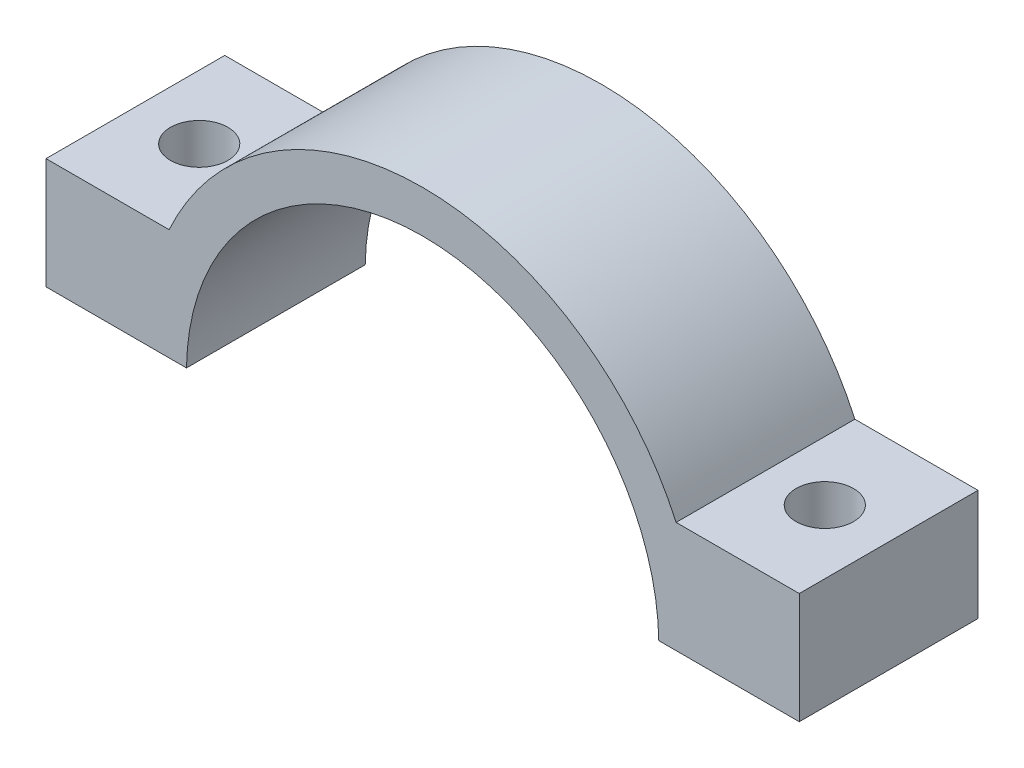
ISO-10303-21;
HEADER;
FILE_DESCRIPTION(('STEP AP214'),'2;1');
FILE_NAME('part.step','',(''),(''),'','','');
FILE_SCHEMA(('AUTOMOTIVE_DESIGN { 1 0 10303 214 1 1 1 1 }'));
ENDSEC;
DATA;
#1=APPLICATION_CONTEXT('core data for automotive mechanical design processes');
#2=APPLICATION_PROTOCOL_DEFINITION('international standard','automotive_design',2000,#1);
#3=PRODUCT_CONTEXT('',#1,'mechanical');
#4=PRODUCT('Part','Part','',(#3));
#5=PRODUCT_RELATED_PRODUCT_CATEGORY('part','',(#4));
#6=PRODUCT_DEFINITION_FORMATION('','',#4);
#7=PRODUCT_DEFINITION_CONTEXT('part definition',#1,'design');
#8=PRODUCT_DEFINITION('design','',#6,#7);
#9=PRODUCT_DEFINITION_SHAPE('','',#8);
#10=(LENGTH_UNIT() NAMED_UNIT(*) SI_UNIT(.MILLI.,.METRE.));
#11=(NAMED_UNIT(*) PLANE_ANGLE_UNIT() SI_UNIT($,.RADIAN.));
#12=(NAMED_UNIT(*) SI_UNIT($,.STERADIAN.) SOLID_ANGLE_UNIT());
#13=UNCERTAINTY_MEASURE_WITH_UNIT(LENGTH_MEASURE(1.E-05),#10,'distance_accuracy_value','');
#14=(GEOMETRIC_REPRESENTATION_CONTEXT(3) GLOBAL_UNCERTAINTY_ASSIGNED_CONTEXT((#13)) GLOBAL_UNIT_ASSIGNED_CONTEXT((#10,
#11,#12)) REPRESENTATION_CONTEXT('',''));
#15=CARTESIAN_POINT('',(0.,0.,0.));
#16=DIRECTION('',(0.,0.,1.));
#17=DIRECTION('',(1.,0.,0.));
#18=AXIS2_PLACEMENT_3D('',#15,#16,#17);
#19=CARTESIAN_POINT('',(0.,28.4999999993568,14.));
#20=DIRECTION('',(0.,0.,-1.));
#21=DIRECTION('',(-1.,0.,0.));
#22=AXIS2_PLACEMENT_3D('',#19,#20,#21);
#23=CYLINDRICAL_SURFACE('',#22,21.8000000006432);
#24=CARTESIAN_POINT('',(0.,28.4999999993568,0.));
#25=DIRECTION('',(0.,0.,1.));
#26=DIRECTION('',(-1.,0.,0.));
#27=AXIS2_PLACEMENT_3D('',#24,#25,#26);
#28=CIRCLE('',#27,21.8000000006432);
#29=CARTESIAN_POINT('',(19.855477834,37.5,0.));
#30=VERTEX_POINT('',#29);
#31=CARTESIAN_POINT('',(-19.855477834,37.5,0.));
#32=VERTEX_POINT('',#31);
#33=EDGE_CURVE('E150',#30,#32,#28,.T.);
#34=ORIENTED_EDGE('',*,*,#33,.T.);
#35=DIRECTION('',(0.,0.,-1.));
#36=VECTOR('',#35,1.);
#37=CARTESIAN_POINT('',(-19.855477834,37.5,14.));
#38=LINE('',#37,#36);
#39=CARTESIAN_POINT('',(-19.855477834,37.5,14.));
#40=VERTEX_POINT('',#39);
#41=EDGE_CURVE('E11',#40,#32,#38,.T.);
#42=ORIENTED_EDGE('',*,*,#41,.F.);
#43=CARTESIAN_POINT('',(0.,28.4999999993568,14.));
#44=DIRECTION('',(0.,0.,1.));
#45=DIRECTION('',(-1.,0.,0.));
#46=AXIS2_PLACEMENT_3D('',#43,#44,#45);
#47=CIRCLE('',#46,21.8000000006432);
#48=CARTESIAN_POINT('',(19.855477834,37.5,14.));
#49=VERTEX_POINT('',#48);
#50=EDGE_CURVE('E172',#49,#40,#47,.T.);
#51=ORIENTED_EDGE('',*,*,#50,.F.);
#52=DIRECTION('',(0.,0.,-1.));
#53=VECTOR('',#52,1.);
#54=CARTESIAN_POINT('',(19.855477834,37.5,14.));
#55=LINE('',#54,#53);
#56=EDGE_CURVE('E146',#49,#30,#55,.T.);
#57=ORIENTED_EDGE('',*,*,#56,.T.);
#58=EDGE_LOOP('',(#34,#42,#51,#57));
#59=FACE_BOUND('',#58,.T.);
#60=ADVANCED_FACE('F45',(#59),#23,.T.);
#61=CARTESIAN_POINT('',(-29.5,37.5,14.));
#62=DIRECTION('',(0.,-1.,0.));
#63=DIRECTION('',(0.,0.,-1.));
#64=AXIS2_PLACEMENT_3D('',#61,#62,#63);
#65=PLANE('',#64);
#66=CARTESIAN_POINT('',(-24.5,37.5,7.));
#67=DIRECTION('',(0.,-1.,0.));
#68=DIRECTION('',(0.,0.,-1.));
#69=AXIS2_PLACEMENT_3D('',#66,#67,#68);
#70=CIRCLE('',#69,2.25);
#71=CARTESIAN_POINT('',(-24.5,37.5,4.75));
#72=VERTEX_POINT('',#71);
#73=EDGE_CURVE('E154',#72,#72,#70,.F.);
#74=ORIENTED_EDGE('',*,*,#73,.F.);
#75=EDGE_LOOP('',(#74));
#76=FACE_BOUND('',#75,.T.);
#77=DIRECTION('',(-1.,0.,0.));
#78=VECTOR('',#77,1.);
#79=CARTESIAN_POINT('',(-29.5,37.5,0.));
#80=LINE('',#79,#78);
#81=CARTESIAN_POINT('',(-29.5,37.5,0.));
#82=VERTEX_POINT('',#81);
#83=EDGE_CURVE('E153',#32,#82,#80,.T.);
#84=ORIENTED_EDGE('',*,*,#83,.T.);
#85=DIRECTION('',(0.,0.,-1.));
#86=VECTOR('',#85,1.);
#87=CARTESIAN_POINT('',(-29.5,37.5,14.));
#88=LINE('',#87,#86);
#89=CARTESIAN_POINT('',(-29.5,37.5,14.));
#90=VERTEX_POINT('',#89);
#91=EDGE_CURVE('E55',#90,#82,#88,.T.);
#92=ORIENTED_EDGE('',*,*,#91,.F.);
#93=DIRECTION('',(-1.,0.,0.));
#94=VECTOR('',#93,1.);
#95=CARTESIAN_POINT('',(-29.5,37.5,14.));
#96=LINE('',#95,#94);
#97=EDGE_CURVE('E107',#40,#90,#96,.T.);
#98=ORIENTED_EDGE('',*,*,#97,.F.);
#99=ORIENTED_EDGE('',*,*,#41,.T.);
#100=EDGE_LOOP('',(#84,#92,#98,#99));
#101=FACE_BOUND('',#100,.T.);
#102=ADVANCED_FACE('F243',(#76,#101),#65,.F.);
#103=CARTESIAN_POINT('',(-29.5,28.8,14.));
#104=DIRECTION('',(1.,0.,0.));
#105=DIRECTION('',(0.,0.,-1.));
#106=AXIS2_PLACEMENT_3D('',#103,#104,#105);
#107=PLANE('',#106);
#108=DIRECTION('',(0.,-1.,0.));
#109=VECTOR('',#108,1.);
#110=CARTESIAN_POINT('',(-29.5,28.8,0.));
#111=LINE('',#110,#109);
#112=CARTESIAN_POINT('',(-29.5,28.8,0.));
#113=VERTEX_POINT('',#112);
#114=EDGE_CURVE('E157',#82,#113,#111,.T.);
#115=ORIENTED_EDGE('',*,*,#114,.T.);
#116=DIRECTION('',(0.,0.,-1.));
#117=VECTOR('',#116,1.);
#118=CARTESIAN_POINT('',(-29.5,28.8,14.));
#119=LINE('',#118,#117);
#120=CARTESIAN_POINT('',(-29.5,28.8,14.));
#121=VERTEX_POINT('',#120);
#122=EDGE_CURVE('E183',#121,#113,#119,.T.);
#123=ORIENTED_EDGE('',*,*,#122,.F.);
#124=DIRECTION('',(0.,-1.,0.));
#125=VECTOR('',#124,1.);
#126=CARTESIAN_POINT('',(-29.5,28.8,14.));
#127=LINE('',#126,#125);
#128=EDGE_CURVE('E210',#90,#121,#127,.T.);
#129=ORIENTED_EDGE('',*,*,#128,.F.);
#130=ORIENTED_EDGE('',*,*,#91,.T.);
#131=EDGE_LOOP('',(#115,#123,#129,#130));
#132=FACE_BOUND('',#131,.T.);
#133=ADVANCED_FACE('F246',(#132),#107,.F.);
#134=CARTESIAN_POINT('',(-18.497567408,28.8,14.));
#135=DIRECTION('',(0.,1.,0.));
#136=DIRECTION('',(0.,0.,1.));
#137=AXIS2_PLACEMENT_3D('',#134,#135,#136);
#138=PLANE('',#137);
#139=CARTESIAN_POINT('',(-24.5,28.8,7.));
#140=DIRECTION('',(0.,1.,0.));
#141=DIRECTION('',(0.,0.,1.));
#142=AXIS2_PLACEMENT_3D('',#139,#140,#141);
#143=CIRCLE('',#142,2.25);
#144=CARTESIAN_POINT('',(-24.5,28.8,9.25));
#145=VERTEX_POINT('',#144);
#146=EDGE_CURVE('E48',#145,#145,#143,.F.);
#147=ORIENTED_EDGE('',*,*,#146,.F.);
#148=EDGE_LOOP('',(#147));
#149=FACE_BOUND('',#148,.T.);
#150=DIRECTION('',(1.,0.,0.));
#151=VECTOR('',#150,1.);
#152=CARTESIAN_POINT('',(-18.497567408,28.8,0.));
#153=LINE('',#152,#151);
#154=CARTESIAN_POINT('',(-18.497567408,28.8,0.));
#155=VERTEX_POINT('',#154);
#156=EDGE_CURVE('E160',#113,#155,#153,.T.);
#157=ORIENTED_EDGE('',*,*,#156,.T.);
#158=DIRECTION('',(0.,0.,-1.));
#159=VECTOR('',#158,1.);
#160=CARTESIAN_POINT('',(-18.497567408,28.8,14.));
#161=LINE('',#160,#159);
#162=CARTESIAN_POINT('',(-18.497567408,28.8,14.));
#163=VERTEX_POINT('',#162);
#164=EDGE_CURVE('E179',#163,#155,#161,.T.);
#165=ORIENTED_EDGE('',*,*,#164,.F.);
#166=DIRECTION('',(1.,0.,0.));
#167=VECTOR('',#166,1.);
#168=CARTESIAN_POINT('',(-18.497567408,28.8,14.));
#169=LINE('',#168,#167);
#170=EDGE_CURVE('E213',#121,#163,#169,.T.);
#171=ORIENTED_EDGE('',*,*,#170,.F.);
#172=ORIENTED_EDGE('',*,*,#122,.T.);
#173=EDGE_LOOP('',(#157,#165,#171,#172));
#174=FACE_BOUND('',#173,.T.);
#175=ADVANCED_FACE('F220',(#149,#174),#138,.F.);
#176=CARTESIAN_POINT('',(0.,28.4999999993568,14.));
#177=DIRECTION('',(0.,0.,-1.));
#178=DIRECTION('',(-1.,0.,0.));
#179=AXIS2_PLACEMENT_3D('',#176,#177,#178);
#180=CYLINDRICAL_SURFACE('',#179,18.5000000003754);
#181=CARTESIAN_POINT('',(0.,28.4999999993568,0.));
#182=DIRECTION('',(0.,0.,-1.));
#183=DIRECTION('',(1.,0.,0.));
#184=AXIS2_PLACEMENT_3D('',#181,#182,#183);
#185=CIRCLE('',#184,18.5000000003754);
#186=CARTESIAN_POINT('',(18.497567408,28.8,0.));
#187=VERTEX_POINT('',#186);
#188=EDGE_CURVE('E163',#155,#187,#185,.T.);
#189=ORIENTED_EDGE('',*,*,#188,.T.);
#190=DIRECTION('',(0.,0.,-1.));
#191=VECTOR('',#190,1.);
#192=CARTESIAN_POINT('',(18.497567408,28.8,14.));
#193=LINE('',#192,#191);
#194=CARTESIAN_POINT('',(18.497567408,28.8,14.));
#195=VERTEX_POINT('',#194);
#196=EDGE_CURVE('E137',#195,#187,#193,.T.);
#197=ORIENTED_EDGE('',*,*,#196,.F.);
#198=CARTESIAN_POINT('',(0.,28.4999999993568,14.));
#199=DIRECTION('',(0.,0.,-1.));
#200=DIRECTION('',(1.,0.,0.));
#201=AXIS2_PLACEMENT_3D('',#198,#199,#200);
#202=CIRCLE('',#201,18.5000000003754);
#203=EDGE_CURVE('E126',#163,#195,#202,.T.);
#204=ORIENTED_EDGE('',*,*,#203,.F.);
#205=ORIENTED_EDGE('',*,*,#164,.T.);
#206=EDGE_LOOP('',(#189,#197,#204,#205));
#207=FACE_BOUND('',#206,.T.);
#208=ADVANCED_FACE('F224',(#207),#180,.F.);
#209=CARTESIAN_POINT('',(29.5,28.8,14.));
#210=DIRECTION('',(0.,1.,0.));
#211=DIRECTION('',(0.,0.,1.));
#212=AXIS2_PLACEMENT_3D('',#209,#210,#211);
#213=PLANE('',#212);
#214=CARTESIAN_POINT('',(24.5,28.8,7.));
#215=DIRECTION('',(0.,1.,0.));
#216=DIRECTION('',(0.,0.,1.));
#217=AXIS2_PLACEMENT_3D('',#214,#215,#216);
#218=CIRCLE('',#217,2.25);
#219=CARTESIAN_POINT('',(24.5,28.8,9.25));
#220=VERTEX_POINT('',#219);
#221=EDGE_CURVE('E192',#220,#220,#218,.F.);
#222=ORIENTED_EDGE('',*,*,#221,.F.);
#223=EDGE_LOOP('',(#222));
#224=FACE_BOUND('',#223,.T.);
#225=DIRECTION('',(1.,0.,0.));
#226=VECTOR('',#225,1.);
#227=CARTESIAN_POINT('',(29.5,28.8,0.));
#228=LINE('',#227,#226);
#229=CARTESIAN_POINT('',(29.5,28.8,0.));
#230=VERTEX_POINT('',#229);
#231=EDGE_CURVE('E135',#187,#230,#228,.T.);
#232=ORIENTED_EDGE('',*,*,#231,.T.);
#233=DIRECTION('',(0.,0.,-1.));
#234=VECTOR('',#233,1.);
#235=CARTESIAN_POINT('',(29.5,28.8,14.));
#236=LINE('',#235,#234);
#237=CARTESIAN_POINT('',(29.5,28.8,14.));
#238=VERTEX_POINT('',#237);
#239=EDGE_CURVE('E132',#238,#230,#236,.T.);
#240=ORIENTED_EDGE('',*,*,#239,.F.);
#241=DIRECTION('',(1.,0.,0.));
#242=VECTOR('',#241,1.);
#243=CARTESIAN_POINT('',(29.5,28.8,14.));
#244=LINE('',#243,#242);
#245=EDGE_CURVE('E120',#195,#238,#244,.T.);
#246=ORIENTED_EDGE('',*,*,#245,.F.);
#247=ORIENTED_EDGE('',*,*,#196,.T.);
#248=EDGE_LOOP('',(#232,#240,#246,#247));
#249=FACE_BOUND('',#248,.T.);
#250=ADVANCED_FACE('F133',(#224,#249),#213,.F.);
#251=CARTESIAN_POINT('',(29.5,37.5,14.));
#252=DIRECTION('',(-1.,0.,0.));
#253=DIRECTION('',(0.,0.,1.));
#254=AXIS2_PLACEMENT_3D('',#251,#252,#253);
#255=PLANE('',#254);
#256=DIRECTION('',(0.,1.,0.));
#257=VECTOR('',#256,1.);
#258=CARTESIAN_POINT('',(29.5,37.5,0.));
#259=LINE('',#258,#257);
#260=CARTESIAN_POINT('',(29.5,37.5,0.));
#261=VERTEX_POINT('',#260);
#262=EDGE_CURVE('E93',#230,#261,#259,.T.);
#263=ORIENTED_EDGE('',*,*,#262,.T.);
#264=DIRECTION('',(0.,0.,-1.));
#265=VECTOR('',#264,1.);
#266=CARTESIAN_POINT('',(29.5,37.5,14.));
#267=LINE('',#266,#265);
#268=CARTESIAN_POINT('',(29.5,37.5,14.));
#269=VERTEX_POINT('',#268);
#270=EDGE_CURVE('E138',#269,#261,#267,.T.);
#271=ORIENTED_EDGE('',*,*,#270,.F.);
#272=DIRECTION('',(0.,1.,0.));
#273=VECTOR('',#272,1.);
#274=CARTESIAN_POINT('',(29.5,37.5,14.));
#275=LINE('',#274,#273);
#276=EDGE_CURVE('E124',#238,#269,#275,.T.);
#277=ORIENTED_EDGE('',*,*,#276,.F.);
#278=ORIENTED_EDGE('',*,*,#239,.T.);
#279=EDGE_LOOP('',(#263,#271,#277,#278));
#280=FACE_BOUND('',#279,.T.);
#281=ADVANCED_FACE('F140',(#280),#255,.F.);
#282=CARTESIAN_POINT('',(19.855477834,37.5,14.));
#283=DIRECTION('',(0.,-1.,0.));
#284=DIRECTION('',(0.,0.,-1.));
#285=AXIS2_PLACEMENT_3D('',#282,#283,#284);
#286=PLANE('',#285);
#287=CARTESIAN_POINT('',(24.5,37.5,7.));
#288=DIRECTION('',(0.,-1.,0.));
#289=DIRECTION('',(0.,0.,-1.));
#290=AXIS2_PLACEMENT_3D('',#287,#288,#289);
#291=CIRCLE('',#290,2.25);
#292=CARTESIAN_POINT('',(24.5,37.5,4.75));
#293=VERTEX_POINT('',#292);
#294=EDGE_CURVE('E189',#293,#293,#291,.F.);
#295=ORIENTED_EDGE('',*,*,#294,.F.);
#296=EDGE_LOOP('',(#295));
#297=FACE_BOUND('',#296,.T.);
#298=DIRECTION('',(-1.,0.,0.));
#299=VECTOR('',#298,1.);
#300=CARTESIAN_POINT('',(19.855477834,37.5,0.));
#301=LINE('',#300,#299);
#302=EDGE_CURVE('E99',#261,#30,#301,.T.);
#303=ORIENTED_EDGE('',*,*,#302,.T.);
#304=ORIENTED_EDGE('',*,*,#56,.F.);
#305=DIRECTION('',(-1.,0.,0.));
#306=VECTOR('',#305,1.);
#307=CARTESIAN_POINT('',(19.855477834,37.5,14.));
#308=LINE('',#307,#306);
#309=EDGE_CURVE('E64',#269,#49,#308,.T.);
#310=ORIENTED_EDGE('',*,*,#309,.F.);
#311=ORIENTED_EDGE('',*,*,#270,.T.);
#312=EDGE_LOOP('',(#303,#304,#310,#311));
#313=FACE_BOUND('',#312,.T.);
#314=ADVANCED_FACE('F232',(#297,#313),#286,.F.);
#315=CARTESIAN_POINT('',(0.,28.4999999993568,14.));
#316=DIRECTION('',(0.,0.,-1.));
#317=DIRECTION('',(-1.,0.,0.));
#318=AXIS2_PLACEMENT_3D('',#315,#316,#317);
#319=PLANE('',#318);
#320=ORIENTED_EDGE('',*,*,#50,.T.);
#321=ORIENTED_EDGE('',*,*,#97,.T.);
#322=ORIENTED_EDGE('',*,*,#128,.T.);
#323=ORIENTED_EDGE('',*,*,#170,.T.);
#324=ORIENTED_EDGE('',*,*,#203,.T.);
#325=ORIENTED_EDGE('',*,*,#245,.T.);
#326=ORIENTED_EDGE('',*,*,#276,.T.);
#327=ORIENTED_EDGE('',*,*,#309,.T.);
#328=EDGE_LOOP('',(#320,#321,#322,#323,#324,#325,#326,#327));
#329=FACE_BOUND('',#328,.T.);
#330=ADVANCED_FACE('F122',(#329),#319,.F.);
#331=CARTESIAN_POINT('',(0.,28.4999999993568,0.));
#332=DIRECTION('',(0.,0.,-1.));
#333=DIRECTION('',(-1.,0.,0.));
#334=AXIS2_PLACEMENT_3D('',#331,#332,#333);
#335=PLANE('',#334);
#336=ORIENTED_EDGE('',*,*,#33,.F.);
#337=ORIENTED_EDGE('',*,*,#302,.F.);
#338=ORIENTED_EDGE('',*,*,#262,.F.);
#339=ORIENTED_EDGE('',*,*,#231,.F.);
#340=ORIENTED_EDGE('',*,*,#188,.F.);
#341=ORIENTED_EDGE('',*,*,#156,.F.);
#342=ORIENTED_EDGE('',*,*,#114,.F.);
#343=ORIENTED_EDGE('',*,*,#83,.F.);
#344=EDGE_LOOP('',(#336,#337,#338,#339,#340,#341,#342,#343));
#345=FACE_BOUND('',#344,.T.);
#346=ADVANCED_FACE('F227',(#345),#335,.T.);
#347=CARTESIAN_POINT('',(24.5,28.8,7.));
#348=DIRECTION('',(0.,-1.,0.));
#349=DIRECTION('',(0.,0.,-1.));
#350=AXIS2_PLACEMENT_3D('',#347,#348,#349);
#351=CYLINDRICAL_SURFACE('',#350,2.25);
#352=ORIENTED_EDGE('',*,*,#294,.T.);
#353=EDGE_LOOP('',(#352));
#354=FACE_BOUND('',#353,.T.);
#355=ORIENTED_EDGE('',*,*,#221,.T.);
#356=EDGE_LOOP('',(#355));
#357=FACE_BOUND('',#356,.T.);
#358=ADVANCED_FACE('F286',(#354,#357),#351,.F.);
#359=CARTESIAN_POINT('',(-24.5,28.8,7.));
#360=DIRECTION('',(0.,-1.,0.));
#361=DIRECTION('',(0.,0.,-1.));
#362=AXIS2_PLACEMENT_3D('',#359,#360,#361);
#363=CYLINDRICAL_SURFACE('',#362,2.25);
#364=ORIENTED_EDGE('',*,*,#146,.T.);
#365=EDGE_LOOP('',(#364));
#366=FACE_BOUND('',#365,.T.);
#367=ORIENTED_EDGE('',*,*,#73,.T.);
#368=EDGE_LOOP('',(#367));
#369=FACE_BOUND('',#368,.T.);
#370=ADVANCED_FACE('F334',(#366,#369),#363,.F.);
#371=CLOSED_SHELL('',(#60,#102,#133,#175,#208,#250,#281,#314,#330,#346,#358,#370));
#372=MANIFOLD_SOLID_BREP('B2',#371);
#373=ADVANCED_BREP_SHAPE_REPRESENTATION('',(#18,#372),#14);
#374=SHAPE_DEFINITION_REPRESENTATION(#9,#373);
ENDSEC;
END-ISO-10303-21;
